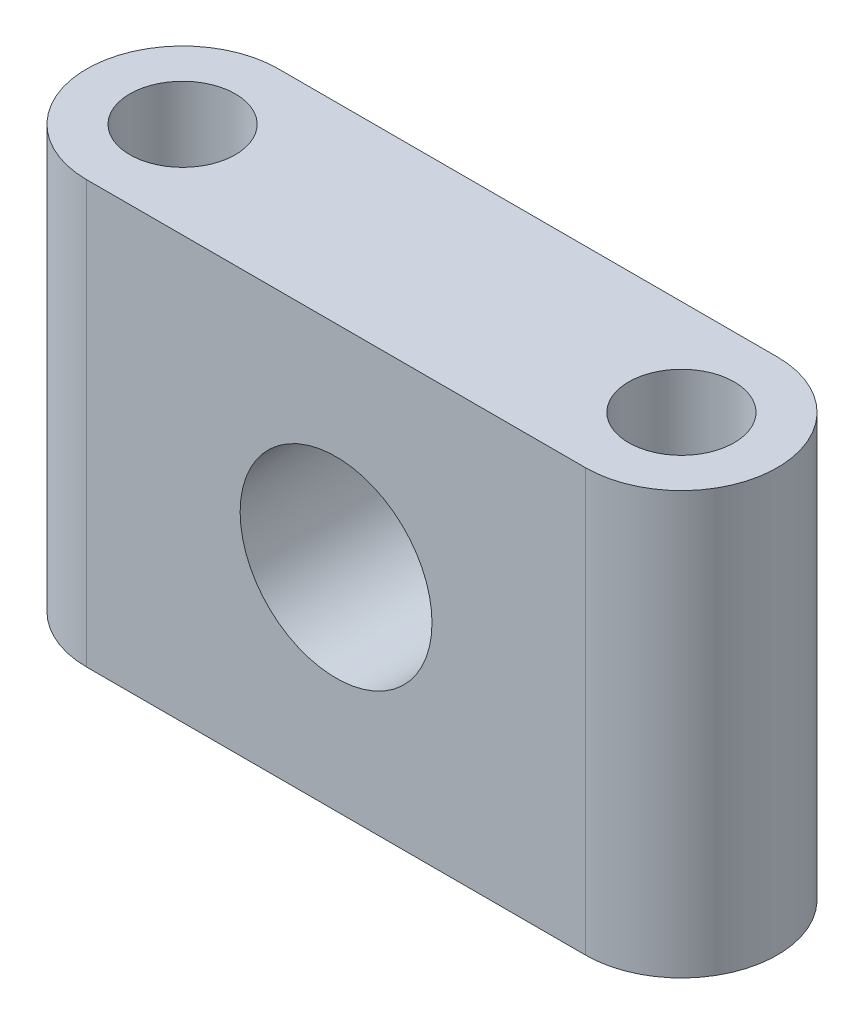
ISO-10303-21;
HEADER;
FILE_DESCRIPTION(('STEP AP214'),'2;1');
FILE_NAME('part.step','',(''),(''),'','','');
FILE_SCHEMA(('AUTOMOTIVE_DESIGN { 1 0 10303 214 1 1 1 1 }'));
ENDSEC;
DATA;
#1=APPLICATION_CONTEXT('core data for automotive mechanical design processes');
#2=APPLICATION_PROTOCOL_DEFINITION('international standard','automotive_design',2000,#1);
#3=PRODUCT_CONTEXT('',#1,'mechanical');
#4=PRODUCT('Part','Part','',(#3));
#5=PRODUCT_RELATED_PRODUCT_CATEGORY('part','',(#4));
#6=PRODUCT_DEFINITION_FORMATION('','',#4);
#7=PRODUCT_DEFINITION_CONTEXT('part definition',#1,'design');
#8=PRODUCT_DEFINITION('design','',#6,#7);
#9=PRODUCT_DEFINITION_SHAPE('','',#8);
#10=(LENGTH_UNIT() NAMED_UNIT(*) SI_UNIT(.MILLI.,.METRE.));
#11=(NAMED_UNIT(*) PLANE_ANGLE_UNIT() SI_UNIT($,.RADIAN.));
#12=(NAMED_UNIT(*) SI_UNIT($,.STERADIAN.) SOLID_ANGLE_UNIT());
#13=UNCERTAINTY_MEASURE_WITH_UNIT(LENGTH_MEASURE(1.E-05),#10,'distance_accuracy_value','');
#14=(GEOMETRIC_REPRESENTATION_CONTEXT(3) GLOBAL_UNCERTAINTY_ASSIGNED_CONTEXT((#13)) GLOBAL_UNIT_ASSIGNED_CONTEXT((#10,
#11,#12)) REPRESENTATION_CONTEXT('',''));
#15=CARTESIAN_POINT('',(0.,0.,0.));
#16=DIRECTION('',(0.,0.,1.));
#17=DIRECTION('',(1.,0.,0.));
#18=AXIS2_PLACEMENT_3D('',#15,#16,#17);
#19=CARTESIAN_POINT('',(-13.,-11.,0.));
#20=DIRECTION('',(0.,1.,0.));
#21=DIRECTION('',(0.,0.,-1.));
#22=AXIS2_PLACEMENT_3D('',#19,#20,#21);
#23=CYLINDRICAL_SURFACE('',#22,5.);
#24=DIRECTION('',(0.,1.,0.));
#25=VECTOR('',#24,1.);
#26=CARTESIAN_POINT('',(-13.,-11.,-5.));
#27=LINE('',#26,#25);
#28=CARTESIAN_POINT('',(-13.,-11.,-5.));
#29=VERTEX_POINT('',#28);
#30=CARTESIAN_POINT('',(-13.,11.,-5.));
#31=VERTEX_POINT('',#30);
#32=EDGE_CURVE('E20',#29,#31,#27,.T.);
#33=ORIENTED_EDGE('',*,*,#32,.F.);
#34=CARTESIAN_POINT('',(-13.,-11.,0.));
#35=DIRECTION('',(0.,-1.,0.));
#36=DIRECTION('',(0.,0.,-1.));
#37=AXIS2_PLACEMENT_3D('',#34,#35,#36);
#38=CIRCLE('',#37,5.);
#39=CARTESIAN_POINT('',(-13.,-11.,5.));
#40=VERTEX_POINT('',#39);
#41=EDGE_CURVE('E114',#40,#29,#38,.T.);
#42=ORIENTED_EDGE('',*,*,#41,.F.);
#43=DIRECTION('',(0.,1.,0.));
#44=VECTOR('',#43,1.);
#45=CARTESIAN_POINT('',(-13.,-11.,5.));
#46=LINE('',#45,#44);
#47=CARTESIAN_POINT('',(-13.,11.,5.));
#48=VERTEX_POINT('',#47);
#49=EDGE_CURVE('E11',#40,#48,#46,.T.);
#50=ORIENTED_EDGE('',*,*,#49,.T.);
#51=CARTESIAN_POINT('',(-13.,11.,0.));
#52=DIRECTION('',(0.,-1.,0.));
#53=DIRECTION('',(0.,0.,-1.));
#54=AXIS2_PLACEMENT_3D('',#51,#52,#53);
#55=CIRCLE('',#54,5.);
#56=EDGE_CURVE('E76',#48,#31,#55,.T.);
#57=ORIENTED_EDGE('',*,*,#56,.T.);
#58=EDGE_LOOP('',(#33,#42,#50,#57));
#59=FACE_BOUND('',#58,.T.);
#60=ADVANCED_FACE('F17',(#59),#23,.T.);
#61=CARTESIAN_POINT('',(-13.,-11.,5.));
#62=DIRECTION('',(0.,0.,1.));
#63=DIRECTION('',(-1.,0.,0.));
#64=AXIS2_PLACEMENT_3D('',#61,#62,#63);
#65=PLANE('',#64);
#66=CARTESIAN_POINT('',(0.,0.,5.));
#67=DIRECTION('',(0.,0.,1.));
#68=DIRECTION('',(1.,0.,0.));
#69=AXIS2_PLACEMENT_3D('',#66,#67,#68);
#70=CIRCLE('',#69,5.);
#71=CARTESIAN_POINT('',(5.,0.,5.));
#72=VERTEX_POINT('',#71);
#73=EDGE_CURVE('E88',#72,#72,#70,.T.);
#74=ORIENTED_EDGE('',*,*,#73,.F.);
#75=EDGE_LOOP('',(#74));
#76=FACE_BOUND('',#75,.T.);
#77=ORIENTED_EDGE('',*,*,#49,.F.);
#78=DIRECTION('',(-1.,0.,0.));
#79=VECTOR('',#78,1.);
#80=CARTESIAN_POINT('',(-13.,-11.,5.));
#81=LINE('',#80,#79);
#82=CARTESIAN_POINT('',(13.,-11.,5.));
#83=VERTEX_POINT('',#82);
#84=EDGE_CURVE('E38',#83,#40,#81,.T.);
#85=ORIENTED_EDGE('',*,*,#84,.F.);
#86=DIRECTION('',(0.,1.,0.));
#87=VECTOR('',#86,1.);
#88=CARTESIAN_POINT('',(13.,-11.,5.));
#89=LINE('',#88,#87);
#90=CARTESIAN_POINT('',(13.,11.,5.));
#91=VERTEX_POINT('',#90);
#92=EDGE_CURVE('E26',#83,#91,#89,.T.);
#93=ORIENTED_EDGE('',*,*,#92,.T.);
#94=DIRECTION('',(-1.,0.,0.));
#95=VECTOR('',#94,1.);
#96=CARTESIAN_POINT('',(-13.,11.,5.));
#97=LINE('',#96,#95);
#98=EDGE_CURVE('E108',#91,#48,#97,.T.);
#99=ORIENTED_EDGE('',*,*,#98,.T.);
#100=EDGE_LOOP('',(#77,#85,#93,#99));
#101=FACE_BOUND('',#100,.T.);
#102=ADVANCED_FACE('F107',(#76,#101),#65,.T.);
#103=CARTESIAN_POINT('',(13.,-11.,0.));
#104=DIRECTION('',(0.,1.,0.));
#105=DIRECTION('',(0.,0.,-1.));
#106=AXIS2_PLACEMENT_3D('',#103,#104,#105);
#107=CYLINDRICAL_SURFACE('',#106,5.);
#108=ORIENTED_EDGE('',*,*,#92,.F.);
#109=CARTESIAN_POINT('',(13.,-11.,0.));
#110=DIRECTION('',(0.,-1.,0.));
#111=DIRECTION('',(0.,0.,-1.));
#112=AXIS2_PLACEMENT_3D('',#109,#110,#111);
#113=CIRCLE('',#112,5.);
#114=CARTESIAN_POINT('',(13.,-11.,-5.));
#115=VERTEX_POINT('',#114);
#116=EDGE_CURVE('E45',#115,#83,#113,.T.);
#117=ORIENTED_EDGE('',*,*,#116,.F.);
#118=DIRECTION('',(0.,1.,0.));
#119=VECTOR('',#118,1.);
#120=CARTESIAN_POINT('',(13.,-11.,-5.));
#121=LINE('',#120,#119);
#122=CARTESIAN_POINT('',(13.,11.,-5.));
#123=VERTEX_POINT('',#122);
#124=EDGE_CURVE('E93',#115,#123,#121,.T.);
#125=ORIENTED_EDGE('',*,*,#124,.T.);
#126=CARTESIAN_POINT('',(13.,11.,0.));
#127=DIRECTION('',(0.,-1.,0.));
#128=DIRECTION('',(0.,0.,-1.));
#129=AXIS2_PLACEMENT_3D('',#126,#127,#128);
#130=CIRCLE('',#129,5.);
#131=EDGE_CURVE('E77',#123,#91,#130,.T.);
#132=ORIENTED_EDGE('',*,*,#131,.T.);
#133=EDGE_LOOP('',(#108,#117,#125,#132));
#134=FACE_BOUND('',#133,.T.);
#135=ADVANCED_FACE('F110',(#134),#107,.T.);
#136=CARTESIAN_POINT('',(-13.,-11.,-5.));
#137=DIRECTION('',(0.,0.,-1.));
#138=DIRECTION('',(1.,0.,0.));
#139=AXIS2_PLACEMENT_3D('',#136,#137,#138);
#140=PLANE('',#139);
#141=CARTESIAN_POINT('',(0.,0.,-5.));
#142=DIRECTION('',(0.,0.,1.));
#143=DIRECTION('',(1.,0.,0.));
#144=AXIS2_PLACEMENT_3D('',#141,#142,#143);
#145=CIRCLE('',#144,5.);
#146=CARTESIAN_POINT('',(5.,0.,-5.));
#147=VERTEX_POINT('',#146);
#148=EDGE_CURVE('E150',#147,#147,#145,.T.);
#149=ORIENTED_EDGE('',*,*,#148,.T.);
#150=EDGE_LOOP('',(#149));
#151=FACE_BOUND('',#150,.T.);
#152=ORIENTED_EDGE('',*,*,#124,.F.);
#153=DIRECTION('',(1.,0.,0.));
#154=VECTOR('',#153,1.);
#155=CARTESIAN_POINT('',(-13.,-11.,-5.));
#156=LINE('',#155,#154);
#157=EDGE_CURVE('E91',#29,#115,#156,.T.);
#158=ORIENTED_EDGE('',*,*,#157,.F.);
#159=ORIENTED_EDGE('',*,*,#32,.T.);
#160=DIRECTION('',(1.,0.,0.));
#161=VECTOR('',#160,1.);
#162=CARTESIAN_POINT('',(-13.,11.,-5.));
#163=LINE('',#162,#161);
#164=EDGE_CURVE('E72',#31,#123,#163,.T.);
#165=ORIENTED_EDGE('',*,*,#164,.T.);
#166=EDGE_LOOP('',(#152,#158,#159,#165));
#167=FACE_BOUND('',#166,.T.);
#168=ADVANCED_FACE('F90',(#151,#167),#140,.T.);
#169=CARTESIAN_POINT('',(-13.,-11.,0.));
#170=DIRECTION('',(0.,1.,0.));
#171=DIRECTION('',(0.,0.,-1.));
#172=AXIS2_PLACEMENT_3D('',#169,#170,#171);
#173=PLANE('',#172);
#174=CARTESIAN_POINT('',(13.,-11.,0.));
#175=DIRECTION('',(0.,-1.,0.));
#176=DIRECTION('',(0.,0.,-1.));
#177=AXIS2_PLACEMENT_3D('',#174,#175,#176);
#178=CIRCLE('',#177,2.75);
#179=CARTESIAN_POINT('',(13.,-11.,-2.75));
#180=VERTEX_POINT('',#179);
#181=EDGE_CURVE('E162',#180,#180,#178,.T.);
#182=ORIENTED_EDGE('',*,*,#181,.F.);
#183=EDGE_LOOP('',(#182));
#184=FACE_BOUND('',#183,.T.);
#185=CARTESIAN_POINT('',(-13.,-11.,0.));
#186=DIRECTION('',(0.,-1.,0.));
#187=DIRECTION('',(0.,0.,-1.));
#188=AXIS2_PLACEMENT_3D('',#185,#186,#187);
#189=CIRCLE('',#188,2.75);
#190=CARTESIAN_POINT('',(-13.,-11.,-2.75));
#191=VERTEX_POINT('',#190);
#192=EDGE_CURVE('E155',#191,#191,#189,.T.);
#193=ORIENTED_EDGE('',*,*,#192,.F.);
#194=EDGE_LOOP('',(#193));
#195=FACE_BOUND('',#194,.T.);
#196=ORIENTED_EDGE('',*,*,#41,.T.);
#197=ORIENTED_EDGE('',*,*,#157,.T.);
#198=ORIENTED_EDGE('',*,*,#116,.T.);
#199=ORIENTED_EDGE('',*,*,#84,.T.);
#200=EDGE_LOOP('',(#196,#197,#198,#199));
#201=FACE_BOUND('',#200,.T.);
#202=ADVANCED_FACE('F121',(#184,#195,#201),#173,.F.);
#203=CARTESIAN_POINT('',(-13.,11.,0.));
#204=DIRECTION('',(0.,1.,0.));
#205=DIRECTION('',(0.,0.,-1.));
#206=AXIS2_PLACEMENT_3D('',#203,#204,#205);
#207=PLANE('',#206);
#208=CARTESIAN_POINT('',(13.,11.,0.));
#209=DIRECTION('',(0.,-1.,0.));
#210=DIRECTION('',(0.,0.,-1.));
#211=AXIS2_PLACEMENT_3D('',#208,#209,#210);
#212=CIRCLE('',#211,2.75);
#213=CARTESIAN_POINT('',(13.,11.,-2.75));
#214=VERTEX_POINT('',#213);
#215=EDGE_CURVE('E166',#214,#214,#212,.T.);
#216=ORIENTED_EDGE('',*,*,#215,.T.);
#217=EDGE_LOOP('',(#216));
#218=FACE_BOUND('',#217,.T.);
#219=CARTESIAN_POINT('',(-13.,11.,0.));
#220=DIRECTION('',(0.,-1.,0.));
#221=DIRECTION('',(0.,0.,-1.));
#222=AXIS2_PLACEMENT_3D('',#219,#220,#221);
#223=CIRCLE('',#222,2.75);
#224=CARTESIAN_POINT('',(-13.,11.,-2.75));
#225=VERTEX_POINT('',#224);
#226=EDGE_CURVE('E158',#225,#225,#223,.T.);
#227=ORIENTED_EDGE('',*,*,#226,.T.);
#228=EDGE_LOOP('',(#227));
#229=FACE_BOUND('',#228,.T.);
#230=ORIENTED_EDGE('',*,*,#56,.F.);
#231=ORIENTED_EDGE('',*,*,#98,.F.);
#232=ORIENTED_EDGE('',*,*,#131,.F.);
#233=ORIENTED_EDGE('',*,*,#164,.F.);
#234=EDGE_LOOP('',(#230,#231,#232,#233));
#235=FACE_BOUND('',#234,.T.);
#236=ADVANCED_FACE('F74',(#218,#229,#235),#207,.T.);
#237=CARTESIAN_POINT('',(0.,0.,5.));
#238=DIRECTION('',(0.,0.,-1.));
#239=DIRECTION('',(1.,0.,0.));
#240=AXIS2_PLACEMENT_3D('',#237,#238,#239);
#241=CYLINDRICAL_SURFACE('',#240,5.);
#242=ORIENTED_EDGE('',*,*,#73,.T.);
#243=EDGE_LOOP('',(#242));
#244=FACE_BOUND('',#243,.T.);
#245=ORIENTED_EDGE('',*,*,#148,.F.);
#246=EDGE_LOOP('',(#245));
#247=FACE_BOUND('',#246,.T.);
#248=ADVANCED_FACE('F130',(#244,#247),#241,.F.);
#249=CARTESIAN_POINT('',(-13.,-11.,0.));
#250=DIRECTION('',(0.,1.,0.));
#251=DIRECTION('',(0.,0.,-1.));
#252=AXIS2_PLACEMENT_3D('',#249,#250,#251);
#253=CYLINDRICAL_SURFACE('',#252,2.75);
#254=ORIENTED_EDGE('',*,*,#192,.T.);
#255=EDGE_LOOP('',(#254));
#256=FACE_BOUND('',#255,.T.);
#257=ORIENTED_EDGE('',*,*,#226,.F.);
#258=EDGE_LOOP('',(#257));
#259=FACE_BOUND('',#258,.T.);
#260=ADVANCED_FACE('F177',(#256,#259),#253,.F.);
#261=CARTESIAN_POINT('',(13.,-11.,0.));
#262=DIRECTION('',(0.,1.,0.));
#263=DIRECTION('',(0.,0.,-1.));
#264=AXIS2_PLACEMENT_3D('',#261,#262,#263);
#265=CYLINDRICAL_SURFACE('',#264,2.75);
#266=ORIENTED_EDGE('',*,*,#181,.T.);
#267=EDGE_LOOP('',(#266));
#268=FACE_BOUND('',#267,.T.);
#269=ORIENTED_EDGE('',*,*,#215,.F.);
#270=EDGE_LOOP('',(#269));
#271=FACE_BOUND('',#270,.T.);
#272=ADVANCED_FACE('F174',(#268,#271),#265,.F.);
#273=CLOSED_SHELL('',(#60,#102,#135,#168,#202,#236,#248,#260,#272));
#274=MANIFOLD_SOLID_BREP('B1',#273);
#275=ADVANCED_BREP_SHAPE_REPRESENTATION('',(#18,#274),#14);
#276=SHAPE_DEFINITION_REPRESENTATION(#9,#275);
ENDSEC;
END-ISO-10303-21;
